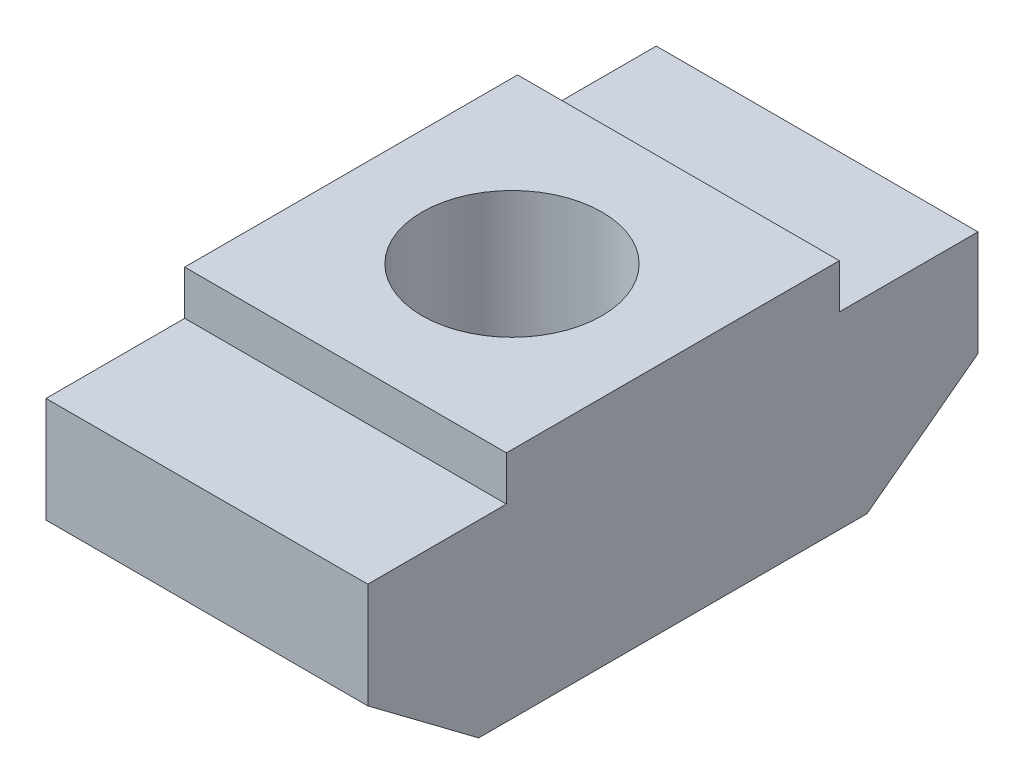
ISO-10303-21;
HEADER;
FILE_DESCRIPTION(('STEP AP214'),'2;1');
FILE_NAME('part.step','',(''),(''),'','','');
FILE_SCHEMA(('AUTOMOTIVE_DESIGN { 1 0 10303 214 1 1 1 1 }'));
ENDSEC;
DATA;
#1=APPLICATION_CONTEXT('core data for automotive mechanical design processes');
#2=APPLICATION_PROTOCOL_DEFINITION('international standard','automotive_design',2000,#1);
#3=PRODUCT_CONTEXT('',#1,'mechanical');
#4=PRODUCT('Part','Part','',(#3));
#5=PRODUCT_RELATED_PRODUCT_CATEGORY('part','',(#4));
#6=PRODUCT_DEFINITION_FORMATION('','',#4);
#7=PRODUCT_DEFINITION_CONTEXT('part definition',#1,'design');
#8=PRODUCT_DEFINITION('design','',#6,#7);
#9=PRODUCT_DEFINITION_SHAPE('','',#8);
#10=(LENGTH_UNIT() NAMED_UNIT(*) SI_UNIT(.MILLI.,.METRE.));
#11=(NAMED_UNIT(*) PLANE_ANGLE_UNIT() SI_UNIT($,.RADIAN.));
#12=(NAMED_UNIT(*) SI_UNIT($,.STERADIAN.) SOLID_ANGLE_UNIT());
#13=UNCERTAINTY_MEASURE_WITH_UNIT(LENGTH_MEASURE(1.E-05),#10,'distance_accuracy_value','');
#14=(GEOMETRIC_REPRESENTATION_CONTEXT(3) GLOBAL_UNCERTAINTY_ASSIGNED_CONTEXT((#13)) GLOBAL_UNIT_ASSIGNED_CONTEXT((#10,
#11,#12)) REPRESENTATION_CONTEXT('',''));
#15=CARTESIAN_POINT('',(0.,0.,0.));
#16=DIRECTION('',(0.,0.,1.));
#17=DIRECTION('',(1.,0.,0.));
#18=AXIS2_PLACEMENT_3D('',#15,#16,#17);
#19=CARTESIAN_POINT('',(-2.9,0.,5.5));
#20=DIRECTION('',(0.,0.,1.));
#21=DIRECTION('',(1.,0.,0.));
#22=AXIS2_PLACEMENT_3D('',#19,#20,#21);
#23=PLANE('',#22);
#24=DIRECTION('',(-1.,0.,0.));
#25=VECTOR('',#24,1.);
#26=CARTESIAN_POINT('',(0.,1.3,5.5));
#27=LINE('',#26,#25);
#28=CARTESIAN_POINT('',(2.9,1.3,5.5));
#29=VERTEX_POINT('',#28);
#30=CARTESIAN_POINT('',(-2.9,1.3,5.5));
#31=VERTEX_POINT('',#30);
#32=EDGE_CURVE('E19',#29,#31,#27,.T.);
#33=ORIENTED_EDGE('',*,*,#32,.T.);
#34=DIRECTION('',(0.,-1.,0.));
#35=VECTOR('',#34,1.);
#36=CARTESIAN_POINT('',(-2.9,0.,5.5));
#37=LINE('',#36,#35);
#38=CARTESIAN_POINT('',(-2.9,-0.6,5.5));
#39=VERTEX_POINT('',#38);
#40=EDGE_CURVE('E10',#31,#39,#37,.T.);
#41=ORIENTED_EDGE('',*,*,#40,.T.);
#42=DIRECTION('',(1.,0.,0.));
#43=VECTOR('',#42,1.);
#44=CARTESIAN_POINT('',(0.,-0.6,5.5));
#45=LINE('',#44,#43);
#46=CARTESIAN_POINT('',(2.9,-0.6,5.5));
#47=VERTEX_POINT('',#46);
#48=EDGE_CURVE('E105',#39,#47,#45,.T.);
#49=ORIENTED_EDGE('',*,*,#48,.T.);
#50=DIRECTION('',(0.,1.,0.));
#51=VECTOR('',#50,1.);
#52=CARTESIAN_POINT('',(2.9,0.,5.5));
#53=LINE('',#52,#51);
#54=EDGE_CURVE('E101',#47,#29,#53,.T.);
#55=ORIENTED_EDGE('',*,*,#54,.T.);
#56=EDGE_LOOP('',(#33,#41,#49,#55));
#57=FACE_BOUND('',#56,.T.);
#58=ADVANCED_FACE('F15',(#57),#23,.T.);
#59=CARTESIAN_POINT('',(-2.9,0.,-5.5));
#60=DIRECTION('',(-1.,0.,0.));
#61=DIRECTION('',(0.,0.,1.));
#62=AXIS2_PLACEMENT_3D('',#59,#60,#61);
#63=PLANE('',#62);
#64=DIRECTION('',(0.,1.,0.));
#65=VECTOR('',#64,1.);
#66=CARTESIAN_POINT('',(-2.9,1.05,3.));
#67=LINE('',#66,#65);
#68=CARTESIAN_POINT('',(-2.9,1.3,3.));
#69=VERTEX_POINT('',#68);
#70=CARTESIAN_POINT('',(-2.9,2.1,3.));
#71=VERTEX_POINT('',#70);
#72=EDGE_CURVE('E160',#69,#71,#67,.T.);
#73=ORIENTED_EDGE('',*,*,#72,.T.);
#74=DIRECTION('',(0.,0.,1.));
#75=VECTOR('',#74,1.);
#76=CARTESIAN_POINT('',(-2.9,2.1,5.5));
#77=LINE('',#76,#75);
#78=CARTESIAN_POINT('',(-2.9,2.1,-3.));
#79=VERTEX_POINT('',#78);
#80=EDGE_CURVE('E111',#79,#71,#77,.T.);
#81=ORIENTED_EDGE('',*,*,#80,.F.);
#82=DIRECTION('',(0.,-1.,0.));
#83=VECTOR('',#82,1.);
#84=CARTESIAN_POINT('',(-2.9,0.65,-3.));
#85=LINE('',#84,#83);
#86=CARTESIAN_POINT('',(-2.9,1.3,-3.));
#87=VERTEX_POINT('',#86);
#88=EDGE_CURVE('E202',#79,#87,#85,.T.);
#89=ORIENTED_EDGE('',*,*,#88,.T.);
#90=DIRECTION('',(0.,0.,-1.));
#91=VECTOR('',#90,1.);
#92=CARTESIAN_POINT('',(-2.9,1.3,-5.5));
#93=LINE('',#92,#91);
#94=CARTESIAN_POINT('',(-2.9,1.3,-5.5));
#95=VERTEX_POINT('',#94);
#96=EDGE_CURVE('E155',#87,#95,#93,.T.);
#97=ORIENTED_EDGE('',*,*,#96,.T.);
#98=DIRECTION('',(0.,-1.,0.));
#99=VECTOR('',#98,1.);
#100=CARTESIAN_POINT('',(-2.9,0.,-5.5));
#101=LINE('',#100,#99);
#102=CARTESIAN_POINT('',(-2.9,-0.6,-5.5));
#103=VERTEX_POINT('',#102);
#104=EDGE_CURVE('E135',#95,#103,#101,.T.);
#105=ORIENTED_EDGE('',*,*,#104,.T.);
#106=DIRECTION('',(0.,-0.6,0.8));
#107=VECTOR('',#106,1.);
#108=CARTESIAN_POINT('',(-2.9,-1.242,-4.644));
#109=LINE('',#108,#107);
#110=CARTESIAN_POINT('',(-2.9,-2.1,-3.5));
#111=VERTEX_POINT('',#110);
#112=EDGE_CURVE('E121',#103,#111,#109,.T.);
#113=ORIENTED_EDGE('',*,*,#112,.T.);
#114=DIRECTION('',(0.,0.,-1.));
#115=VECTOR('',#114,1.);
#116=CARTESIAN_POINT('',(-2.9,-2.1,5.5));
#117=LINE('',#116,#115);
#118=CARTESIAN_POINT('',(-2.9,-2.1,3.5));
#119=VERTEX_POINT('',#118);
#120=EDGE_CURVE('E26',#119,#111,#117,.T.);
#121=ORIENTED_EDGE('',*,*,#120,.F.);
#122=DIRECTION('',(0.,0.6,0.8));
#123=VECTOR('',#122,1.);
#124=CARTESIAN_POINT('',(-2.9,-3.132,2.124));
#125=LINE('',#124,#123);
#126=EDGE_CURVE('E146',#119,#39,#125,.T.);
#127=ORIENTED_EDGE('',*,*,#126,.T.);
#128=ORIENTED_EDGE('',*,*,#40,.F.);
#129=DIRECTION('',(0.,0.,-1.));
#130=VECTOR('',#129,1.);
#131=CARTESIAN_POINT('',(-2.9,1.3,-1.25));
#132=LINE('',#131,#130);
#133=EDGE_CURVE('E124',#31,#69,#132,.T.);
#134=ORIENTED_EDGE('',*,*,#133,.T.);
#135=EDGE_LOOP('',(#73,#81,#89,#97,#105,#113,#121,#127,#128,#134));
#136=FACE_BOUND('',#135,.T.);
#137=ADVANCED_FACE('F178',(#136),#63,.T.);
#138=CARTESIAN_POINT('',(0.,-2.1,0.));
#139=DIRECTION('',(0.,-1.,0.));
#140=DIRECTION('',(0.,0.,-1.));
#141=AXIS2_PLACEMENT_3D('',#138,#139,#140);
#142=PLANE('',#141);
#143=DIRECTION('',(1.,0.,0.));
#144=VECTOR('',#143,1.);
#145=CARTESIAN_POINT('',(1.45,-2.1,-3.5));
#146=LINE('',#145,#144);
#147=CARTESIAN_POINT('',(2.9,-2.1,-3.5));
#148=VERTEX_POINT('',#147);
#149=EDGE_CURVE('E149',#111,#148,#146,.T.);
#150=ORIENTED_EDGE('',*,*,#149,.T.);
#151=DIRECTION('',(0.,0.,1.));
#152=VECTOR('',#151,1.);
#153=CARTESIAN_POINT('',(2.9,-2.1,-5.5));
#154=LINE('',#153,#152);
#155=CARTESIAN_POINT('',(2.9,-2.1,3.5));
#156=VERTEX_POINT('',#155);
#157=EDGE_CURVE('E110',#148,#156,#154,.T.);
#158=ORIENTED_EDGE('',*,*,#157,.T.);
#159=DIRECTION('',(-1.,0.,0.));
#160=VECTOR('',#159,1.);
#161=CARTESIAN_POINT('',(1.45,-2.1,3.5));
#162=LINE('',#161,#160);
#163=EDGE_CURVE('E148',#156,#119,#162,.T.);
#164=ORIENTED_EDGE('',*,*,#163,.T.);
#165=ORIENTED_EDGE('',*,*,#120,.T.);
#166=EDGE_LOOP('',(#150,#158,#164,#165));
#167=FACE_BOUND('',#166,.T.);
#168=CARTESIAN_POINT('',(0.,-2.1,0.));
#169=DIRECTION('',(0.,1.,0.));
#170=DIRECTION('',(1.,0.,0.));
#171=AXIS2_PLACEMENT_3D('',#168,#169,#170);
#172=CIRCLE('',#171,1.621);
#173=CARTESIAN_POINT('',(-1.621,-2.1,0.));
#174=VERTEX_POINT('',#173);
#175=EDGE_CURVE('E141',#174,#174,#172,.T.);
#176=ORIENTED_EDGE('',*,*,#175,.T.);
#177=EDGE_LOOP('',(#176));
#178=FACE_BOUND('',#177,.T.);
#179=ADVANCED_FACE('F191',(#167,#178),#142,.T.);
#180=CARTESIAN_POINT('',(2.9,0.,5.5));
#181=DIRECTION('',(1.,0.,0.));
#182=DIRECTION('',(0.,0.,-1.));
#183=AXIS2_PLACEMENT_3D('',#180,#181,#182);
#184=PLANE('',#183);
#185=DIRECTION('',(0.,-1.,0.));
#186=VECTOR('',#185,1.);
#187=CARTESIAN_POINT('',(2.9,1.05,3.));
#188=LINE('',#187,#186);
#189=CARTESIAN_POINT('',(2.9,2.1,3.));
#190=VERTEX_POINT('',#189);
#191=CARTESIAN_POINT('',(2.9,1.3,3.));
#192=VERTEX_POINT('',#191);
#193=EDGE_CURVE('E117',#190,#192,#188,.T.);
#194=ORIENTED_EDGE('',*,*,#193,.T.);
#195=DIRECTION('',(0.,0.,1.));
#196=VECTOR('',#195,1.);
#197=CARTESIAN_POINT('',(2.9,1.3,4.25));
#198=LINE('',#197,#196);
#199=EDGE_CURVE('E114',#192,#29,#198,.T.);
#200=ORIENTED_EDGE('',*,*,#199,.T.);
#201=ORIENTED_EDGE('',*,*,#54,.F.);
#202=DIRECTION('',(0.,-0.6,-0.8));
#203=VECTOR('',#202,1.);
#204=CARTESIAN_POINT('',(2.9,-0.492,5.644));
#205=LINE('',#204,#203);
#206=EDGE_CURVE('E162',#47,#156,#205,.T.);
#207=ORIENTED_EDGE('',*,*,#206,.T.);
#208=ORIENTED_EDGE('',*,*,#157,.F.);
#209=DIRECTION('',(0.,0.6,-0.8));
#210=VECTOR('',#209,1.);
#211=CARTESIAN_POINT('',(2.9,-3.882,-1.124));
#212=LINE('',#211,#210);
#213=CARTESIAN_POINT('',(2.9,-0.6,-5.5));
#214=VERTEX_POINT('',#213);
#215=EDGE_CURVE('E140',#148,#214,#212,.T.);
#216=ORIENTED_EDGE('',*,*,#215,.T.);
#217=DIRECTION('',(0.,-1.,0.));
#218=VECTOR('',#217,1.);
#219=CARTESIAN_POINT('',(2.9,0.,-5.5));
#220=LINE('',#219,#218);
#221=CARTESIAN_POINT('',(2.9,1.3,-5.5));
#222=VERTEX_POINT('',#221);
#223=EDGE_CURVE('E132',#222,#214,#220,.T.);
#224=ORIENTED_EDGE('',*,*,#223,.F.);
#225=DIRECTION('',(0.,0.,1.));
#226=VECTOR('',#225,1.);
#227=CARTESIAN_POINT('',(2.9,1.3,0.));
#228=LINE('',#227,#226);
#229=CARTESIAN_POINT('',(2.9,1.3,-3.));
#230=VERTEX_POINT('',#229);
#231=EDGE_CURVE('E131',#222,#230,#228,.T.);
#232=ORIENTED_EDGE('',*,*,#231,.T.);
#233=DIRECTION('',(0.,1.,0.));
#234=VECTOR('',#233,1.);
#235=CARTESIAN_POINT('',(2.9,0.65,-3.));
#236=LINE('',#235,#234);
#237=CARTESIAN_POINT('',(2.9,2.1,-3.));
#238=VERTEX_POINT('',#237);
#239=EDGE_CURVE('E169',#230,#238,#236,.T.);
#240=ORIENTED_EDGE('',*,*,#239,.T.);
#241=DIRECTION('',(0.,0.,-1.));
#242=VECTOR('',#241,1.);
#243=CARTESIAN_POINT('',(2.9,2.1,-5.5));
#244=LINE('',#243,#242);
#245=EDGE_CURVE('E34',#190,#238,#244,.T.);
#246=ORIENTED_EDGE('',*,*,#245,.F.);
#247=EDGE_LOOP('',(#194,#200,#201,#207,#208,#216,#224,#232,#240,#246));
#248=FACE_BOUND('',#247,.T.);
#249=ADVANCED_FACE('F115',(#248),#184,.T.);
#250=CARTESIAN_POINT('',(0.,2.1,0.));
#251=DIRECTION('',(0.,1.,0.));
#252=DIRECTION('',(0.,0.,1.));
#253=AXIS2_PLACEMENT_3D('',#250,#251,#252);
#254=PLANE('',#253);
#255=DIRECTION('',(1.,0.,0.));
#256=VECTOR('',#255,1.);
#257=CARTESIAN_POINT('',(1.45,2.1,3.));
#258=LINE('',#257,#256);
#259=EDGE_CURVE('E125',#71,#190,#258,.T.);
#260=ORIENTED_EDGE('',*,*,#259,.T.);
#261=ORIENTED_EDGE('',*,*,#245,.T.);
#262=DIRECTION('',(-1.,0.,0.));
#263=VECTOR('',#262,1.);
#264=CARTESIAN_POINT('',(1.45,2.1,-3.));
#265=LINE('',#264,#263);
#266=EDGE_CURVE('E171',#238,#79,#265,.T.);
#267=ORIENTED_EDGE('',*,*,#266,.T.);
#268=ORIENTED_EDGE('',*,*,#80,.T.);
#269=EDGE_LOOP('',(#260,#261,#267,#268));
#270=FACE_BOUND('',#269,.T.);
#271=CARTESIAN_POINT('',(0.,2.1,0.));
#272=DIRECTION('',(0.,-1.,0.));
#273=DIRECTION('',(1.,0.,0.));
#274=AXIS2_PLACEMENT_3D('',#271,#272,#273);
#275=CIRCLE('',#274,1.621);
#276=CARTESIAN_POINT('',(1.621,2.1,0.));
#277=VERTEX_POINT('',#276);
#278=EDGE_CURVE('E143',#277,#277,#275,.T.);
#279=ORIENTED_EDGE('',*,*,#278,.T.);
#280=EDGE_LOOP('',(#279));
#281=FACE_BOUND('',#280,.T.);
#282=ADVANCED_FACE('F212',(#270,#281),#254,.T.);
#283=CARTESIAN_POINT('',(2.9,0.,-5.5));
#284=DIRECTION('',(0.,0.,-1.));
#285=DIRECTION('',(-1.,0.,0.));
#286=AXIS2_PLACEMENT_3D('',#283,#284,#285);
#287=PLANE('',#286);
#288=DIRECTION('',(-1.,0.,0.));
#289=VECTOR('',#288,1.);
#290=CARTESIAN_POINT('',(2.9,-0.6,-5.5));
#291=LINE('',#290,#289);
#292=EDGE_CURVE('E137',#214,#103,#291,.T.);
#293=ORIENTED_EDGE('',*,*,#292,.T.);
#294=ORIENTED_EDGE('',*,*,#104,.F.);
#295=DIRECTION('',(1.,0.,0.));
#296=VECTOR('',#295,1.);
#297=CARTESIAN_POINT('',(2.9,1.3,-5.5));
#298=LINE('',#297,#296);
#299=EDGE_CURVE('E204',#95,#222,#298,.T.);
#300=ORIENTED_EDGE('',*,*,#299,.T.);
#301=ORIENTED_EDGE('',*,*,#223,.T.);
#302=EDGE_LOOP('',(#293,#294,#300,#301));
#303=FACE_BOUND('',#302,.T.);
#304=ADVANCED_FACE('F185',(#303),#287,.T.);
#305=CARTESIAN_POINT('',(2.9,1.3,-3.));
#306=DIRECTION('',(0.,0.,1.));
#307=DIRECTION('',(0.,1.,0.));
#308=AXIS2_PLACEMENT_3D('',#305,#306,#307);
#309=PLANE('',#308);
#310=ORIENTED_EDGE('',*,*,#88,.F.);
#311=ORIENTED_EDGE('',*,*,#266,.F.);
#312=ORIENTED_EDGE('',*,*,#239,.F.);
#313=DIRECTION('',(-1.,0.,0.));
#314=VECTOR('',#313,1.);
#315=CARTESIAN_POINT('',(2.9,1.3,-3.));
#316=LINE('',#315,#314);
#317=EDGE_CURVE('E152',#230,#87,#316,.T.);
#318=ORIENTED_EDGE('',*,*,#317,.T.);
#319=EDGE_LOOP('',(#310,#311,#312,#318));
#320=FACE_BOUND('',#319,.T.);
#321=ADVANCED_FACE('F217',(#320),#309,.F.);
#322=CARTESIAN_POINT('',(2.9,1.3,-5.5));
#323=DIRECTION('',(0.,-1.,0.));
#324=DIRECTION('',(0.,0.,1.));
#325=AXIS2_PLACEMENT_3D('',#322,#323,#324);
#326=PLANE('',#325);
#327=ORIENTED_EDGE('',*,*,#96,.F.);
#328=ORIENTED_EDGE('',*,*,#317,.F.);
#329=ORIENTED_EDGE('',*,*,#231,.F.);
#330=ORIENTED_EDGE('',*,*,#299,.F.);
#331=EDGE_LOOP('',(#327,#328,#329,#330));
#332=FACE_BOUND('',#331,.T.);
#333=ADVANCED_FACE('F17',(#332),#326,.F.);
#334=CARTESIAN_POINT('',(2.9,-0.6,5.5));
#335=DIRECTION('',(0.,0.8,-0.6));
#336=DIRECTION('',(0.,-0.6,-0.8));
#337=AXIS2_PLACEMENT_3D('',#334,#335,#336);
#338=PLANE('',#337);
#339=ORIENTED_EDGE('',*,*,#126,.F.);
#340=ORIENTED_EDGE('',*,*,#163,.F.);
#341=ORIENTED_EDGE('',*,*,#206,.F.);
#342=ORIENTED_EDGE('',*,*,#48,.F.);
#343=EDGE_LOOP('',(#339,#340,#341,#342));
#344=FACE_BOUND('',#343,.T.);
#345=ADVANCED_FACE('F223',(#344),#338,.F.);
#346=CARTESIAN_POINT('',(2.9,-2.1,-3.5));
#347=DIRECTION('',(0.,0.8,0.6));
#348=DIRECTION('',(0.,0.6,-0.8));
#349=AXIS2_PLACEMENT_3D('',#346,#347,#348);
#350=PLANE('',#349);
#351=ORIENTED_EDGE('',*,*,#112,.F.);
#352=ORIENTED_EDGE('',*,*,#292,.F.);
#353=ORIENTED_EDGE('',*,*,#215,.F.);
#354=ORIENTED_EDGE('',*,*,#149,.F.);
#355=EDGE_LOOP('',(#351,#352,#353,#354));
#356=FACE_BOUND('',#355,.T.);
#357=ADVANCED_FACE('F189',(#356),#350,.F.);
#358=CARTESIAN_POINT('',(2.9,1.3,3.));
#359=DIRECTION('',(0.,-1.,0.));
#360=DIRECTION('',(0.,0.,1.));
#361=AXIS2_PLACEMENT_3D('',#358,#359,#360);
#362=PLANE('',#361);
#363=ORIENTED_EDGE('',*,*,#133,.F.);
#364=ORIENTED_EDGE('',*,*,#32,.F.);
#365=ORIENTED_EDGE('',*,*,#199,.F.);
#366=DIRECTION('',(-1.,0.,0.));
#367=VECTOR('',#366,1.);
#368=CARTESIAN_POINT('',(2.9,1.3,3.));
#369=LINE('',#368,#367);
#370=EDGE_CURVE('E145',#192,#69,#369,.T.);
#371=ORIENTED_EDGE('',*,*,#370,.T.);
#372=EDGE_LOOP('',(#363,#364,#365,#371));
#373=FACE_BOUND('',#372,.T.);
#374=ADVANCED_FACE('F123',(#373),#362,.F.);
#375=CARTESIAN_POINT('',(2.9,2.1,3.));
#376=DIRECTION('',(0.,0.,-1.));
#377=DIRECTION('',(0.,-1.,0.));
#378=AXIS2_PLACEMENT_3D('',#375,#376,#377);
#379=PLANE('',#378);
#380=ORIENTED_EDGE('',*,*,#72,.F.);
#381=ORIENTED_EDGE('',*,*,#370,.F.);
#382=ORIENTED_EDGE('',*,*,#193,.F.);
#383=ORIENTED_EDGE('',*,*,#259,.F.);
#384=EDGE_LOOP('',(#380,#381,#382,#383));
#385=FACE_BOUND('',#384,.T.);
#386=ADVANCED_FACE('F211',(#385),#379,.F.);
#387=CARTESIAN_POINT('',(0.,-11.0255476076238,0.));
#388=DIRECTION('',(0.,-1.,0.));
#389=DIRECTION('',(1.,0.,0.));
#390=AXIS2_PLACEMENT_3D('',#387,#388,#389);
#391=CYLINDRICAL_SURFACE('',#390,1.621);
#392=ORIENTED_EDGE('',*,*,#278,.F.);
#393=EDGE_LOOP('',(#392));
#394=FACE_BOUND('',#393,.T.);
#395=ORIENTED_EDGE('',*,*,#175,.F.);
#396=EDGE_LOOP('',(#395));
#397=FACE_BOUND('',#396,.T.);
#398=ADVANCED_FACE('F243',(#394,#397),#391,.F.);
#399=CLOSED_SHELL('',(#58,#137,#179,#249,#282,#304,#321,#333,#345,#357,#374,#386,#398));
#400=MANIFOLD_SOLID_BREP('B1',#399);
#401=ADVANCED_BREP_SHAPE_REPRESENTATION('',(#18,#400),#14);
#402=SHAPE_DEFINITION_REPRESENTATION(#9,#401);
ENDSEC;
END-ISO-10303-21;
